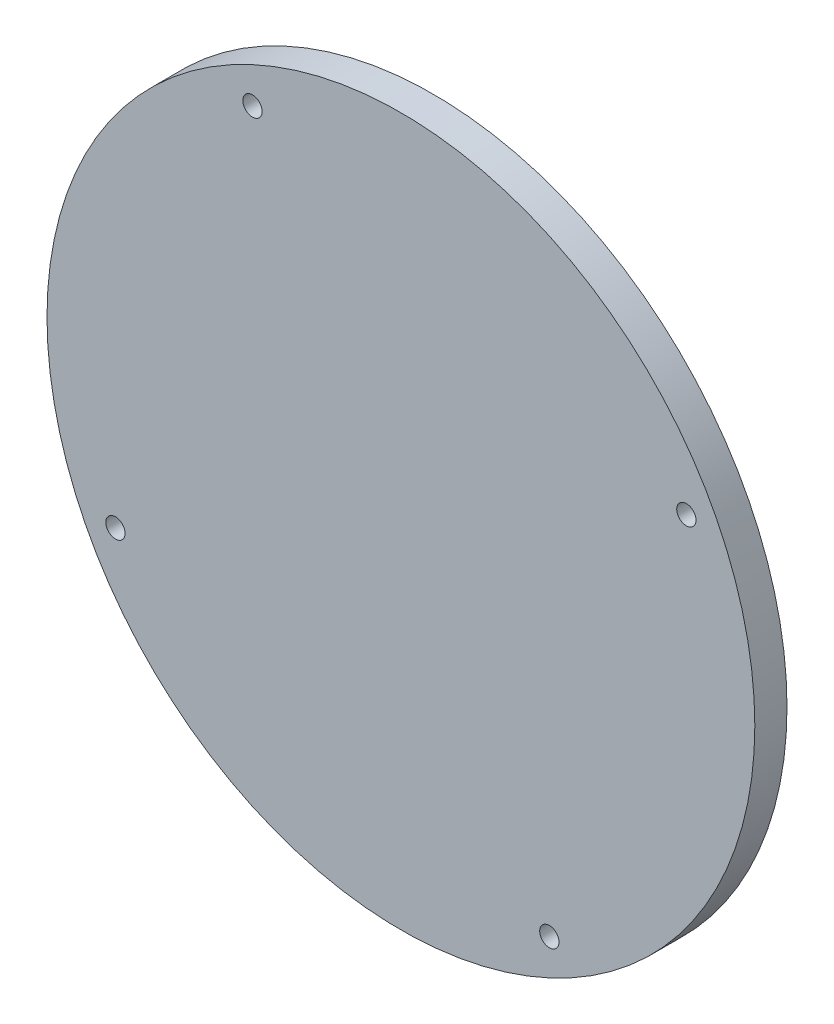
ISO-10303-21;
HEADER;
FILE_DESCRIPTION(('STEP AP214'),'2;1');
FILE_NAME('part.step','',(''),(''),'','','');
FILE_SCHEMA(('AUTOMOTIVE_DESIGN { 1 0 10303 214 1 1 1 1 }'));
ENDSEC;
DATA;
#1=APPLICATION_CONTEXT('core data for automotive mechanical design processes');
#2=APPLICATION_PROTOCOL_DEFINITION('international standard','automotive_design',2000,#1);
#3=PRODUCT_CONTEXT('',#1,'mechanical');
#4=PRODUCT('Part','Part','',(#3));
#5=PRODUCT_RELATED_PRODUCT_CATEGORY('part','',(#4));
#6=PRODUCT_DEFINITION_FORMATION('','',#4);
#7=PRODUCT_DEFINITION_CONTEXT('part definition',#1,'design');
#8=PRODUCT_DEFINITION('design','',#6,#7);
#9=PRODUCT_DEFINITION_SHAPE('','',#8);
#10=(LENGTH_UNIT() NAMED_UNIT(*) SI_UNIT(.MILLI.,.METRE.));
#11=(NAMED_UNIT(*) PLANE_ANGLE_UNIT() SI_UNIT($,.RADIAN.));
#12=(NAMED_UNIT(*) SI_UNIT($,.STERADIAN.) SOLID_ANGLE_UNIT());
#13=UNCERTAINTY_MEASURE_WITH_UNIT(LENGTH_MEASURE(1.E-05),#10,'distance_accuracy_value','');
#14=(GEOMETRIC_REPRESENTATION_CONTEXT(3) GLOBAL_UNCERTAINTY_ASSIGNED_CONTEXT((#13)) GLOBAL_UNIT_ASSIGNED_CONTEXT((#10,
#11,#12)) REPRESENTATION_CONTEXT('',''));
#15=CARTESIAN_POINT('',(0.,0.,0.));
#16=DIRECTION('',(0.,0.,1.));
#17=DIRECTION('',(1.,0.,0.));
#18=AXIS2_PLACEMENT_3D('',#15,#16,#17);
#19=CARTESIAN_POINT('',(0.,0.,5.));
#20=DIRECTION('',(0.,0.,-1.));
#21=DIRECTION('',(-1.,0.,0.));
#22=AXIS2_PLACEMENT_3D('',#19,#20,#21);
#23=CYLINDRICAL_SURFACE('',#22,55.);
#24=CARTESIAN_POINT('',(0.,0.,5.));
#25=DIRECTION('',(0.,0.,1.));
#26=DIRECTION('',(1.,0.,0.));
#27=AXIS2_PLACEMENT_3D('',#24,#25,#26);
#28=CIRCLE('',#27,55.);
#29=CARTESIAN_POINT('',(55.,0.,5.));
#30=VERTEX_POINT('',#29);
#31=EDGE_CURVE('E10',#30,#30,#28,.T.);
#32=ORIENTED_EDGE('',*,*,#31,.F.);
#33=EDGE_LOOP('',(#32));
#34=FACE_BOUND('',#33,.T.);
#35=CARTESIAN_POINT('',(0.,0.,0.));
#36=DIRECTION('',(0.,0.,1.));
#37=DIRECTION('',(1.,0.,0.));
#38=AXIS2_PLACEMENT_3D('',#35,#36,#37);
#39=CIRCLE('',#38,55.);
#40=CARTESIAN_POINT('',(55.,0.,0.));
#41=VERTEX_POINT('',#40);
#42=EDGE_CURVE('E34',#41,#41,#39,.T.);
#43=ORIENTED_EDGE('',*,*,#42,.T.);
#44=EDGE_LOOP('',(#43));
#45=FACE_BOUND('',#44,.T.);
#46=ADVANCED_FACE('F31',(#34,#45),#23,.T.);
#47=CARTESIAN_POINT('',(0.,0.,5.));
#48=DIRECTION('',(0.,0.,1.));
#49=DIRECTION('',(1.,0.,0.));
#50=AXIS2_PLACEMENT_3D('',#47,#48,#49);
#51=PLANE('',#50);
#52=CARTESIAN_POINT('',(23.0682276829684,-44.3605328142775,5.));
#53=DIRECTION('',(0.,0.,1.));
#54=DIRECTION('',(1.,0.,0.));
#55=AXIS2_PLACEMENT_3D('',#52,#53,#54);
#56=CIRCLE('',#55,1.50000000000228);
#57=CARTESIAN_POINT('',(24.5682276829707,-44.3605328142775,5.));
#58=VERTEX_POINT('',#57);
#59=EDGE_CURVE('E61',#58,#58,#56,.T.);
#60=ORIENTED_EDGE('',*,*,#59,.F.);
#61=EDGE_LOOP('',(#60));
#62=FACE_BOUND('',#61,.T.);
#63=CARTESIAN_POINT('',(-44.3605328142794,-23.0682276829678,5.));
#64=DIRECTION('',(0.,0.,1.));
#65=DIRECTION('',(1.,0.,0.));
#66=AXIS2_PLACEMENT_3D('',#63,#64,#65);
#67=CIRCLE('',#66,1.5);
#68=CARTESIAN_POINT('',(-42.8605328142794,-23.0682276829678,5.));
#69=VERTEX_POINT('',#68);
#70=EDGE_CURVE('E55',#69,#69,#67,.T.);
#71=ORIENTED_EDGE('',*,*,#70,.F.);
#72=EDGE_LOOP('',(#71));
#73=FACE_BOUND('',#72,.T.);
#74=CARTESIAN_POINT('',(-23.0682276829697,44.36053281428,5.));
#75=DIRECTION('',(0.,0.,1.));
#76=DIRECTION('',(1.,0.,0.));
#77=AXIS2_PLACEMENT_3D('',#74,#75,#76);
#78=CIRCLE('',#77,1.5000000000011);
#79=CARTESIAN_POINT('',(-21.5682276829686,44.36053281428,5.));
#80=VERTEX_POINT('',#79);
#81=EDGE_CURVE('E49',#80,#80,#78,.T.);
#82=ORIENTED_EDGE('',*,*,#81,.F.);
#83=EDGE_LOOP('',(#82));
#84=FACE_BOUND('',#83,.T.);
#85=CARTESIAN_POINT('',(44.3605328142781,23.0682276829703,5.));
#86=DIRECTION('',(0.,0.,1.));
#87=DIRECTION('',(1.,0.,0.));
#88=AXIS2_PLACEMENT_3D('',#85,#86,#87);
#89=CIRCLE('',#88,1.50000000000304);
#90=CARTESIAN_POINT('',(45.8605328142811,23.0682276829703,5.));
#91=VERTEX_POINT('',#90);
#92=EDGE_CURVE('E43',#91,#91,#89,.T.);
#93=ORIENTED_EDGE('',*,*,#92,.F.);
#94=EDGE_LOOP('',(#93));
#95=FACE_BOUND('',#94,.T.);
#96=ORIENTED_EDGE('',*,*,#31,.T.);
#97=EDGE_LOOP('',(#96));
#98=FACE_BOUND('',#97,.T.);
#99=ADVANCED_FACE('F77',(#62,#73,#84,#95,#98),#51,.T.);
#100=CARTESIAN_POINT('',(0.,0.,0.));
#101=DIRECTION('',(0.,0.,1.));
#102=DIRECTION('',(1.,0.,0.));
#103=AXIS2_PLACEMENT_3D('',#100,#101,#102);
#104=PLANE('',#103);
#105=CARTESIAN_POINT('',(23.0682276829684,-44.3605328142775,0.));
#106=DIRECTION('',(0.,0.,1.));
#107=DIRECTION('',(1.,0.,0.));
#108=AXIS2_PLACEMENT_3D('',#105,#106,#107);
#109=CIRCLE('',#108,1.50000000000228);
#110=CARTESIAN_POINT('',(24.5682276829707,-44.3605328142775,0.));
#111=VERTEX_POINT('',#110);
#112=EDGE_CURVE('E41',#111,#111,#109,.T.);
#113=ORIENTED_EDGE('',*,*,#112,.T.);
#114=EDGE_LOOP('',(#113));
#115=FACE_BOUND('',#114,.T.);
#116=CARTESIAN_POINT('',(-44.3605328142794,-23.0682276829678,0.));
#117=DIRECTION('',(0.,0.,1.));
#118=DIRECTION('',(1.,0.,0.));
#119=AXIS2_PLACEMENT_3D('',#116,#117,#118);
#120=CIRCLE('',#119,1.5);
#121=CARTESIAN_POINT('',(-42.8605328142794,-23.0682276829678,0.));
#122=VERTEX_POINT('',#121);
#123=EDGE_CURVE('E58',#122,#122,#120,.T.);
#124=ORIENTED_EDGE('',*,*,#123,.T.);
#125=EDGE_LOOP('',(#124));
#126=FACE_BOUND('',#125,.T.);
#127=CARTESIAN_POINT('',(-23.0682276829697,44.36053281428,0.));
#128=DIRECTION('',(0.,0.,1.));
#129=DIRECTION('',(1.,0.,0.));
#130=AXIS2_PLACEMENT_3D('',#127,#128,#129);
#131=CIRCLE('',#130,1.5000000000011);
#132=CARTESIAN_POINT('',(-21.5682276829686,44.36053281428,0.));
#133=VERTEX_POINT('',#132);
#134=EDGE_CURVE('E52',#133,#133,#131,.T.);
#135=ORIENTED_EDGE('',*,*,#134,.T.);
#136=EDGE_LOOP('',(#135));
#137=FACE_BOUND('',#136,.T.);
#138=CARTESIAN_POINT('',(44.3605328142781,23.0682276829703,0.));
#139=DIRECTION('',(0.,0.,1.));
#140=DIRECTION('',(1.,0.,0.));
#141=AXIS2_PLACEMENT_3D('',#138,#139,#140);
#142=CIRCLE('',#141,1.50000000000304);
#143=CARTESIAN_POINT('',(45.8605328142811,23.0682276829703,0.));
#144=VERTEX_POINT('',#143);
#145=EDGE_CURVE('E46',#144,#144,#142,.T.);
#146=ORIENTED_EDGE('',*,*,#145,.T.);
#147=EDGE_LOOP('',(#146));
#148=FACE_BOUND('',#147,.T.);
#149=ORIENTED_EDGE('',*,*,#42,.F.);
#150=EDGE_LOOP('',(#149));
#151=FACE_BOUND('',#150,.T.);
#152=ADVANCED_FACE('F67',(#115,#126,#137,#148,#151),#104,.F.);
#153=CARTESIAN_POINT('',(44.3605328142781,23.0682276829703,0.));
#154=DIRECTION('',(0.,0.,1.));
#155=DIRECTION('',(1.,0.,0.));
#156=AXIS2_PLACEMENT_3D('',#153,#154,#155);
#157=CYLINDRICAL_SURFACE('',#156,1.50000000000304);
#158=ORIENTED_EDGE('',*,*,#145,.F.);
#159=EDGE_LOOP('',(#158));
#160=FACE_BOUND('',#159,.T.);
#161=ORIENTED_EDGE('',*,*,#92,.T.);
#162=EDGE_LOOP('',(#161));
#163=FACE_BOUND('',#162,.T.);
#164=ADVANCED_FACE('F87',(#160,#163),#157,.F.);
#165=CARTESIAN_POINT('',(-23.0682276829697,44.36053281428,0.));
#166=DIRECTION('',(0.,0.,1.));
#167=DIRECTION('',(1.,0.,0.));
#168=AXIS2_PLACEMENT_3D('',#165,#166,#167);
#169=CYLINDRICAL_SURFACE('',#168,1.5000000000011);
#170=ORIENTED_EDGE('',*,*,#134,.F.);
#171=EDGE_LOOP('',(#170));
#172=FACE_BOUND('',#171,.T.);
#173=ORIENTED_EDGE('',*,*,#81,.T.);
#174=EDGE_LOOP('',(#173));
#175=FACE_BOUND('',#174,.T.);
#176=ADVANCED_FACE('F89',(#172,#175),#169,.F.);
#177=CARTESIAN_POINT('',(-44.3605328142794,-23.0682276829678,0.));
#178=DIRECTION('',(0.,0.,1.));
#179=DIRECTION('',(1.,0.,0.));
#180=AXIS2_PLACEMENT_3D('',#177,#178,#179);
#181=CYLINDRICAL_SURFACE('',#180,1.5);
#182=ORIENTED_EDGE('',*,*,#123,.F.);
#183=EDGE_LOOP('',(#182));
#184=FACE_BOUND('',#183,.T.);
#185=ORIENTED_EDGE('',*,*,#70,.T.);
#186=EDGE_LOOP('',(#185));
#187=FACE_BOUND('',#186,.T.);
#188=ADVANCED_FACE('F73',(#184,#187),#181,.F.);
#189=CARTESIAN_POINT('',(23.0682276829684,-44.3605328142775,0.));
#190=DIRECTION('',(0.,0.,1.));
#191=DIRECTION('',(1.,0.,0.));
#192=AXIS2_PLACEMENT_3D('',#189,#190,#191);
#193=CYLINDRICAL_SURFACE('',#192,1.50000000000228);
#194=ORIENTED_EDGE('',*,*,#112,.F.);
#195=EDGE_LOOP('',(#194));
#196=FACE_BOUND('',#195,.T.);
#197=ORIENTED_EDGE('',*,*,#59,.T.);
#198=EDGE_LOOP('',(#197));
#199=FACE_BOUND('',#198,.T.);
#200=ADVANCED_FACE('F70',(#196,#199),#193,.F.);
#201=CLOSED_SHELL('',(#46,#99,#152,#164,#176,#188,#200));
#202=MANIFOLD_SOLID_BREP('B2',#201);
#203=ADVANCED_BREP_SHAPE_REPRESENTATION('',(#18,#202),#14);
#204=SHAPE_DEFINITION_REPRESENTATION(#9,#203);
ENDSEC;
END-ISO-10303-21;
